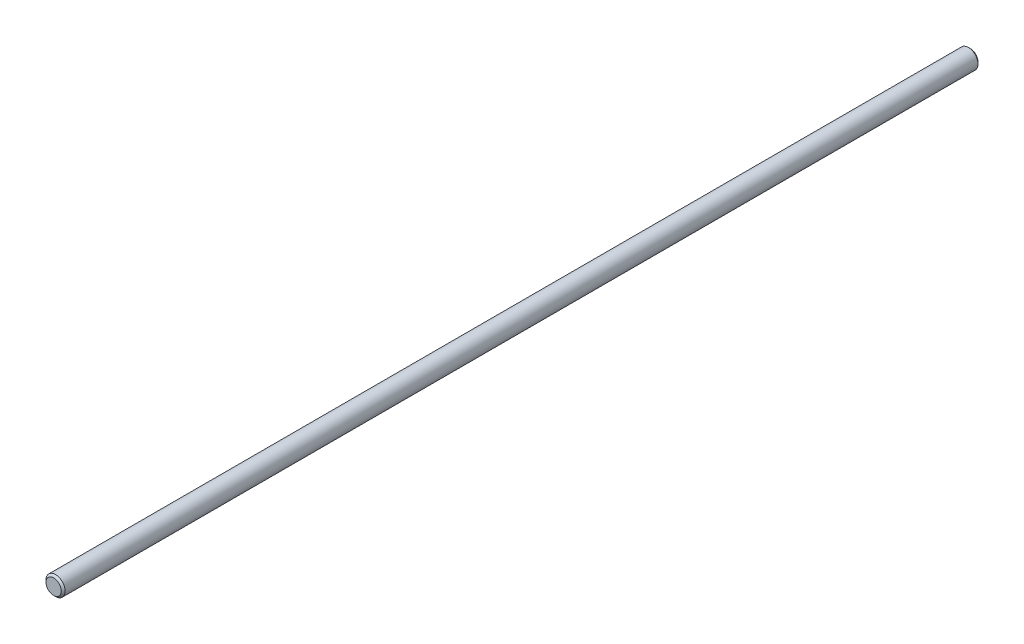
ISO-10303-21;
HEADER;
FILE_DESCRIPTION(('STEP AP214'),'2;1');
FILE_NAME('part.step','',(''),(''),'','','');
FILE_SCHEMA(('AUTOMOTIVE_DESIGN { 1 0 10303 214 1 1 1 1 }'));
ENDSEC;
DATA;
#1=APPLICATION_CONTEXT('core data for automotive mechanical design processes');
#2=APPLICATION_PROTOCOL_DEFINITION('international standard','automotive_design',2000,#1);
#3=PRODUCT_CONTEXT('',#1,'mechanical');
#4=PRODUCT('Part','Part','',(#3));
#5=PRODUCT_RELATED_PRODUCT_CATEGORY('part','',(#4));
#6=PRODUCT_DEFINITION_FORMATION('','',#4);
#7=PRODUCT_DEFINITION_CONTEXT('part definition',#1,'design');
#8=PRODUCT_DEFINITION('design','',#6,#7);
#9=PRODUCT_DEFINITION_SHAPE('','',#8);
#10=(LENGTH_UNIT() NAMED_UNIT(*) SI_UNIT(.MILLI.,.METRE.));
#11=(NAMED_UNIT(*) PLANE_ANGLE_UNIT() SI_UNIT($,.RADIAN.));
#12=(NAMED_UNIT(*) SI_UNIT($,.STERADIAN.) SOLID_ANGLE_UNIT());
#13=UNCERTAINTY_MEASURE_WITH_UNIT(LENGTH_MEASURE(1.E-05),#10,'distance_accuracy_value','');
#14=(GEOMETRIC_REPRESENTATION_CONTEXT(3) GLOBAL_UNCERTAINTY_ASSIGNED_CONTEXT((#13)) GLOBAL_UNIT_ASSIGNED_CONTEXT((#10,
#11,#12)) REPRESENTATION_CONTEXT('',''));
#15=CARTESIAN_POINT('',(0.,0.,0.));
#16=DIRECTION('',(0.,0.,1.));
#17=DIRECTION('',(1.,0.,0.));
#18=AXIS2_PLACEMENT_3D('',#15,#16,#17);
#19=CARTESIAN_POINT('',(0.,0.,152.4));
#20=DIRECTION('',(0.,0.,-1.));
#21=DIRECTION('',(-1.,0.,0.));
#22=AXIS2_PLACEMENT_3D('',#19,#20,#21);
#23=CYLINDRICAL_SURFACE('',#22,3.175);
#24=CARTESIAN_POINT('',(0.,0.,151.765));
#25=DIRECTION('',(0.,0.,1.));
#26=DIRECTION('',(1.,0.,0.));
#27=AXIS2_PLACEMENT_3D('',#24,#25,#26);
#28=CIRCLE('',#27,3.175);
#29=CARTESIAN_POINT('',(-3.175,0.,151.765));
#30=VERTEX_POINT('',#29);
#31=EDGE_CURVE('E37',#30,#30,#28,.F.);
#32=CARTESIAN_POINT('',(0.,0.,-151.765));
#33=DIRECTION('',(0.,0.,1.));
#34=DIRECTION('',(1.,0.,0.));
#35=AXIS2_PLACEMENT_3D('',#32,#33,#34);
#36=CIRCLE('',#35,3.175);
#37=CARTESIAN_POINT('',(-3.175,0.,-151.765));
#38=VERTEX_POINT('',#37);
#39=EDGE_CURVE('E41',#38,#38,#36,.T.);
#40=CARTESIAN_POINT('',(-3.175,0.,151.765));
#41=CARTESIAN_POINT('',(-3.175,0.,148.603229166667));
#42=CARTESIAN_POINT('',(-3.175,0.,145.441458333334));
#43=CARTESIAN_POINT('',(-3.175,0.,139.117916666667));
#44=CARTESIAN_POINT('',(-3.175,0.,135.956145833334));
#45=CARTESIAN_POINT('',(-3.175,0.,129.632604166667));
#46=CARTESIAN_POINT('',(-3.175,0.,126.470833333334));
#47=CARTESIAN_POINT('',(-3.175,0.,120.147291666667));
#48=CARTESIAN_POINT('',(-3.175,0.,116.985520833334));
#49=CARTESIAN_POINT('',(-3.175,0.,110.661979166667));
#50=CARTESIAN_POINT('',(-3.175,0.,107.500208333334));
#51=CARTESIAN_POINT('',(-3.175,0.,101.176666666667));
#52=CARTESIAN_POINT('',(-3.175,0.,98.0148958333336));
#53=CARTESIAN_POINT('',(-3.175,0.,91.6913541666669));
#54=CARTESIAN_POINT('',(-3.175,0.,88.5295833333336));
#55=CARTESIAN_POINT('',(-3.175,0.,82.2060416666669));
#56=CARTESIAN_POINT('',(-3.175,0.,79.0442708333336));
#57=CARTESIAN_POINT('',(-3.175,0.,72.7207291666669));
#58=CARTESIAN_POINT('',(-3.175,0.,69.5589583333336));
#59=CARTESIAN_POINT('',(-3.175,0.,63.2354166666669));
#60=CARTESIAN_POINT('',(-3.175,0.,60.0736458333336));
#61=CARTESIAN_POINT('',(-3.175,0.,53.7501041666669));
#62=CARTESIAN_POINT('',(-3.175,0.,50.5883333333336));
#63=CARTESIAN_POINT('',(-3.175,0.,44.2647916666669));
#64=CARTESIAN_POINT('',(-3.175,0.,41.1030208333336));
#65=CARTESIAN_POINT('',(-3.175,0.,34.7794791666669));
#66=CARTESIAN_POINT('',(-3.175,0.,31.6177083333336));
#67=CARTESIAN_POINT('',(-3.175,0.,25.2941666666669));
#68=CARTESIAN_POINT('',(-3.175,0.,22.1323958333336));
#69=CARTESIAN_POINT('',(-3.175,0.,15.8088541666669));
#70=CARTESIAN_POINT('',(-3.175,0.,12.6470833333336));
#71=CARTESIAN_POINT('',(-3.175,0.,6.3235416666669));
#72=CARTESIAN_POINT('',(-3.175,0.,3.16177083333356));
#73=CARTESIAN_POINT('',(-3.175,0.,-3.16177083333311));
#74=CARTESIAN_POINT('',(-3.175,0.,-6.32354166666645));
#75=CARTESIAN_POINT('',(-3.175,0.,-12.6470833333331));
#76=CARTESIAN_POINT('',(-3.175,0.,-15.8088541666664));
#77=CARTESIAN_POINT('',(-3.175,0.,-22.1323958333331));
#78=CARTESIAN_POINT('',(-3.175,0.,-25.2941666666664));
#79=CARTESIAN_POINT('',(-3.175,0.,-31.6177083333331));
#80=CARTESIAN_POINT('',(-3.175,0.,-34.7794791666664));
#81=CARTESIAN_POINT('',(-3.175,0.,-41.1030208333331));
#82=CARTESIAN_POINT('',(-3.175,0.,-44.2647916666664));
#83=CARTESIAN_POINT('',(-3.175,0.,-50.5883333333331));
#84=CARTESIAN_POINT('',(-3.175,0.,-53.7501041666664));
#85=CARTESIAN_POINT('',(-3.175,0.,-60.0736458333331));
#86=CARTESIAN_POINT('',(-3.175,0.,-63.2354166666664));
#87=CARTESIAN_POINT('',(-3.175,0.,-69.5589583333331));
#88=CARTESIAN_POINT('',(-3.175,0.,-72.7207291666664));
#89=CARTESIAN_POINT('',(-3.175,0.,-79.0442708333331));
#90=CARTESIAN_POINT('',(-3.175,0.,-82.2060416666664));
#91=CARTESIAN_POINT('',(-3.175,0.,-88.5295833333331));
#92=CARTESIAN_POINT('',(-3.175,0.,-91.6913541666664));
#93=CARTESIAN_POINT('',(-3.175,0.,-98.0148958333331));
#94=CARTESIAN_POINT('',(-3.175,0.,-101.176666666666));
#95=CARTESIAN_POINT('',(-3.175,0.,-107.500208333333));
#96=CARTESIAN_POINT('',(-3.175,0.,-110.661979166666));
#97=CARTESIAN_POINT('',(-3.175,0.,-116.985520833333));
#98=CARTESIAN_POINT('',(-3.175,0.,-120.147291666666));
#99=CARTESIAN_POINT('',(-3.175,0.,-126.470833333333));
#100=CARTESIAN_POINT('',(-3.175,0.,-129.632604166666));
#101=CARTESIAN_POINT('',(-3.175,0.,-135.956145833333));
#102=CARTESIAN_POINT('',(-3.175,0.,-139.117916666666));
#103=CARTESIAN_POINT('',(-3.175,0.,-145.441458333333));
#104=CARTESIAN_POINT('',(-3.175,0.,-148.603229166666));
#105=CARTESIAN_POINT('',(-3.175,0.,-151.765));
#106=B_SPLINE_CURVE_WITH_KNOTS('',3,(#40,#41,#42,#43,#44,#45,#46,#47,#48,#49,#50,#51,#52,#53,
#54,#55,#56,#57,#58,#59,#60,#61,#62,#63,#64,#65,#66,#67,#68,#69,#70,#71,#72,#73,#74,#75,#76,#77,
#78,#79,#80,#81,#82,#83,#84,#85,#86,#87,#88,#89,#90,#91,#92,#93,#94,#95,#96,#97,#98,#99,#100,
#101,#102,#103,#104,#105),.UNSPECIFIED.,.F.,.F.,(4,2,2,2,2,2,2,2,2,2,2,2,2,2,2,2,2,2,2,2,2,2,2,
2,2,2,2,2,2,2,2,2,4),(0.,9.48531250000001,18.970625,28.4559375,37.94125,47.4265625,56.911875,
66.3971875,75.8825,85.3678125,94.853125,104.3384375,113.82375,123.3090625,132.794375,
142.2796875,151.765,161.2503125,170.735625,180.2209375,189.70625,199.1915625,208.676875,
218.1621875,227.6475,237.1328125,246.618125,256.1034375,265.58875,275.0740625,284.559375,
294.0446875,303.53),.UNSPECIFIED.);
#107=EDGE_CURVE('BSEAM30',#30,#38,#106,.T.);
#108=ORIENTED_EDGE('',*,*,#31,.T.);
#109=ORIENTED_EDGE('',*,*,#39,.T.);
#110=ORIENTED_EDGE('',*,*,#107,.T.);
#111=ORIENTED_EDGE('',*,*,#107,.F.);
#112=EDGE_LOOP('',(#108,#110,#109,#111));
#113=FACE_BOUND('',#112,.T.);
#114=ADVANCED_FACE('F30',(#113),#23,.T.);
#115=CARTESIAN_POINT('',(0.,0.,152.4));
#116=DIRECTION('',(0.,0.,1.));
#117=DIRECTION('',(1.,0.,0.));
#118=AXIS2_PLACEMENT_3D('',#115,#116,#117);
#119=PLANE('',#118);
#120=CARTESIAN_POINT('',(0.,0.,152.4));
#121=DIRECTION('',(0.,0.,1.));
#122=DIRECTION('',(1.,0.,0.));
#123=AXIS2_PLACEMENT_3D('',#120,#121,#122);
#124=CIRCLE('',#123,2.54000000000024);
#125=CARTESIAN_POINT('',(2.54000000000024,0.,152.4));
#126=VERTEX_POINT('',#125);
#127=EDGE_CURVE('E45',#126,#126,#124,.T.);
#128=ORIENTED_EDGE('',*,*,#127,.T.);
#129=EDGE_LOOP('',(#128));
#130=FACE_BOUND('',#129,.T.);
#131=ADVANCED_FACE('F51',(#130),#119,.T.);
#132=CARTESIAN_POINT('',(0.,0.,-152.4));
#133=DIRECTION('',(0.,0.,1.));
#134=DIRECTION('',(1.,0.,0.));
#135=AXIS2_PLACEMENT_3D('',#132,#133,#134);
#136=PLANE('',#135);
#137=CARTESIAN_POINT('',(0.,0.,-152.4));
#138=DIRECTION('',(0.,0.,1.));
#139=DIRECTION('',(1.,0.,0.));
#140=AXIS2_PLACEMENT_3D('',#137,#138,#139);
#141=CIRCLE('',#140,2.53999999999965);
#142=CARTESIAN_POINT('',(2.53999999999965,0.,-152.4));
#143=VERTEX_POINT('',#142);
#144=EDGE_CURVE('E10',#143,#143,#141,.F.);
#145=ORIENTED_EDGE('',*,*,#144,.T.);
#146=EDGE_LOOP('',(#145));
#147=FACE_BOUND('',#146,.T.);
#148=ADVANCED_FACE('F55',(#147),#136,.F.);
#149=CARTESIAN_POINT('',(0.,0.,152.4));
#150=DIRECTION('',(0.,0.,-1.));
#151=DIRECTION('',(-1.,0.,0.));
#152=AXIS2_PLACEMENT_3D('',#149,#150,#151);
#153=CONICAL_SURFACE('',#152,2.54000000000024,0.78539816339744);
#154=ORIENTED_EDGE('',*,*,#31,.F.);
#155=EDGE_LOOP('',(#154));
#156=FACE_BOUND('',#155,.T.);
#157=ORIENTED_EDGE('',*,*,#127,.F.);
#158=EDGE_LOOP('',(#157));
#159=FACE_BOUND('',#158,.T.);
#160=ADVANCED_FACE('F53',(#156,#159),#153,.T.);
#161=CARTESIAN_POINT('',(0.,0.,-151.765));
#162=DIRECTION('',(0.,0.,1.));
#163=DIRECTION('',(1.,0.,0.));
#164=AXIS2_PLACEMENT_3D('',#161,#162,#163);
#165=CONICAL_SURFACE('',#164,3.175,0.785398163397462);
#166=ORIENTED_EDGE('',*,*,#144,.F.);
#167=EDGE_LOOP('',(#166));
#168=FACE_BOUND('',#167,.T.);
#169=ORIENTED_EDGE('',*,*,#39,.F.);
#170=EDGE_LOOP('',(#169));
#171=FACE_BOUND('',#170,.T.);
#172=ADVANCED_FACE('F32',(#168,#171),#165,.T.);
#173=CLOSED_SHELL('',(#114,#131,#148,#160,#172));
#174=MANIFOLD_SOLID_BREP('B2',#173);
#175=ADVANCED_BREP_SHAPE_REPRESENTATION('',(#18,#174),#14);
#176=SHAPE_DEFINITION_REPRESENTATION(#9,#175);
ENDSEC;
END-ISO-10303-21;
